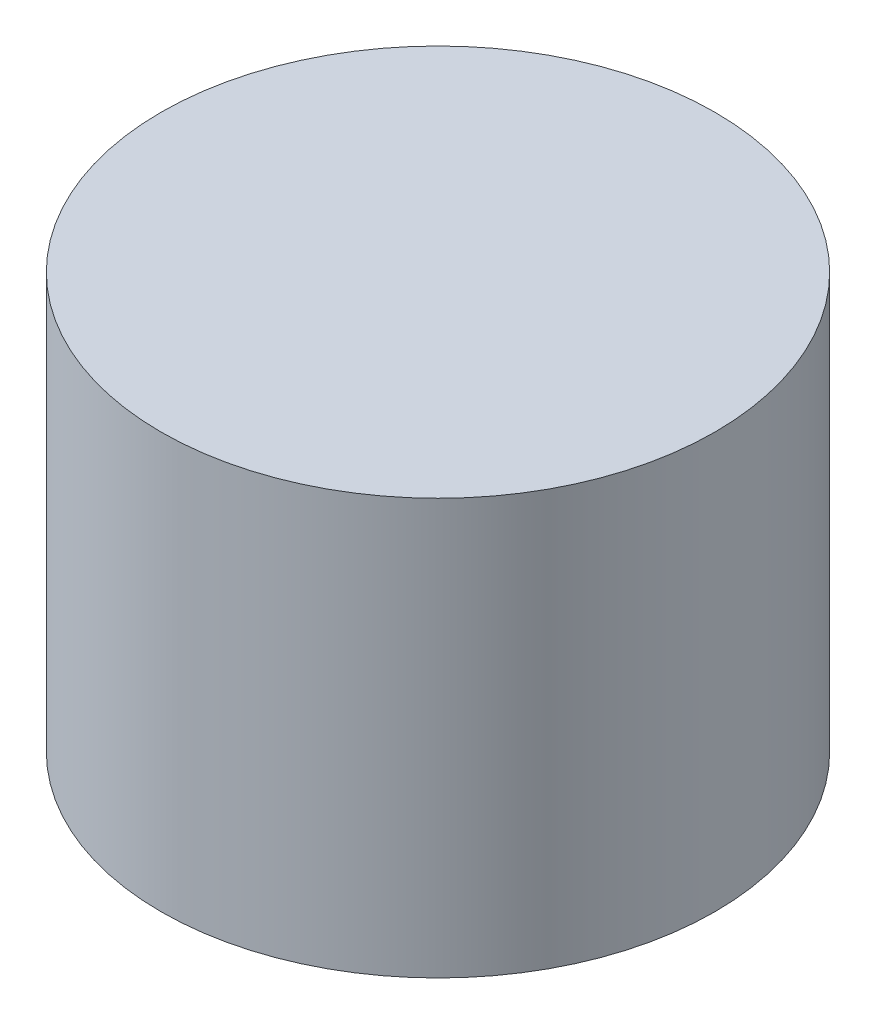
ISO-10303-21;
HEADER;
FILE_DESCRIPTION(('STEP AP214'),'2;1');
FILE_NAME('part.step','',(''),(''),'','','');
FILE_SCHEMA(('AUTOMOTIVE_DESIGN { 1 0 10303 214 1 1 1 1 }'));
ENDSEC;
DATA;
#1=APPLICATION_CONTEXT('core data for automotive mechanical design processes');
#2=APPLICATION_PROTOCOL_DEFINITION('international standard','automotive_design',2000,#1);
#3=PRODUCT_CONTEXT('',#1,'mechanical');
#4=PRODUCT('Part','Part','',(#3));
#5=PRODUCT_RELATED_PRODUCT_CATEGORY('part','',(#4));
#6=PRODUCT_DEFINITION_FORMATION('','',#4);
#7=PRODUCT_DEFINITION_CONTEXT('part definition',#1,'design');
#8=PRODUCT_DEFINITION('design','',#6,#7);
#9=PRODUCT_DEFINITION_SHAPE('','',#8);
#10=(LENGTH_UNIT() NAMED_UNIT(*) SI_UNIT(.MILLI.,.METRE.));
#11=(NAMED_UNIT(*) PLANE_ANGLE_UNIT() SI_UNIT($,.RADIAN.));
#12=(NAMED_UNIT(*) SI_UNIT($,.STERADIAN.) SOLID_ANGLE_UNIT());
#13=UNCERTAINTY_MEASURE_WITH_UNIT(LENGTH_MEASURE(1.E-05),#10,'distance_accuracy_value','');
#14=(GEOMETRIC_REPRESENTATION_CONTEXT(3) GLOBAL_UNCERTAINTY_ASSIGNED_CONTEXT((#13)) GLOBAL_UNIT_ASSIGNED_CONTEXT((#10,
#11,#12)) REPRESENTATION_CONTEXT('',''));
#15=CARTESIAN_POINT('',(0.,0.,0.));
#16=DIRECTION('',(0.,0.,1.));
#17=DIRECTION('',(1.,0.,0.));
#18=AXIS2_PLACEMENT_3D('',#15,#16,#17);
#19=CARTESIAN_POINT('',(0.,3.,0.));
#20=DIRECTION('',(0.,-1.,0.));
#21=DIRECTION('',(0.,0.,-1.));
#22=AXIS2_PLACEMENT_3D('',#19,#20,#21);
#23=CYLINDRICAL_SURFACE('',#22,2.);
#24=CARTESIAN_POINT('',(0.,3.,0.));
#25=DIRECTION('',(0.,1.,0.));
#26=DIRECTION('',(0.,0.,1.));
#27=AXIS2_PLACEMENT_3D('',#24,#25,#26);
#28=CIRCLE('',#27,2.);
#29=CARTESIAN_POINT('',(0.,3.,2.));
#30=VERTEX_POINT('',#29);
#31=EDGE_CURVE('E10',#30,#30,#28,.T.);
#32=ORIENTED_EDGE('',*,*,#31,.F.);
#33=EDGE_LOOP('',(#32));
#34=FACE_BOUND('',#33,.T.);
#35=CARTESIAN_POINT('',(0.,0.,0.));
#36=DIRECTION('',(0.,1.,0.));
#37=DIRECTION('',(0.,0.,1.));
#38=AXIS2_PLACEMENT_3D('',#35,#36,#37);
#39=CIRCLE('',#38,2.);
#40=CARTESIAN_POINT('',(0.,0.,2.));
#41=VERTEX_POINT('',#40);
#42=EDGE_CURVE('E35',#41,#41,#39,.T.);
#43=ORIENTED_EDGE('',*,*,#42,.T.);
#44=EDGE_LOOP('',(#43));
#45=FACE_BOUND('',#44,.T.);
#46=ADVANCED_FACE('F32',(#34,#45),#23,.T.);
#47=CARTESIAN_POINT('',(0.,3.,0.));
#48=DIRECTION('',(0.,1.,0.));
#49=DIRECTION('',(0.,0.,1.));
#50=AXIS2_PLACEMENT_3D('',#47,#48,#49);
#51=PLANE('',#50);
#52=ORIENTED_EDGE('',*,*,#31,.T.);
#53=EDGE_LOOP('',(#52));
#54=FACE_BOUND('',#53,.T.);
#55=ADVANCED_FACE('F47',(#54),#51,.T.);
#56=CARTESIAN_POINT('',(0.,0.,0.));
#57=DIRECTION('',(0.,1.,0.));
#58=DIRECTION('',(0.,0.,1.));
#59=AXIS2_PLACEMENT_3D('',#56,#57,#58);
#60=PLANE('',#59);
#61=ORIENTED_EDGE('',*,*,#42,.F.);
#62=EDGE_LOOP('',(#61));
#63=FACE_BOUND('',#62,.T.);
#64=ADVANCED_FACE('F45',(#63),#60,.F.);
#65=CLOSED_SHELL('',(#46,#55,#64));
#66=MANIFOLD_SOLID_BREP('B2',#65);
#67=ADVANCED_BREP_SHAPE_REPRESENTATION('',(#18,#66),#14);
#68=SHAPE_DEFINITION_REPRESENTATION(#9,#67);
ENDSEC;
END-ISO-10303-21;
